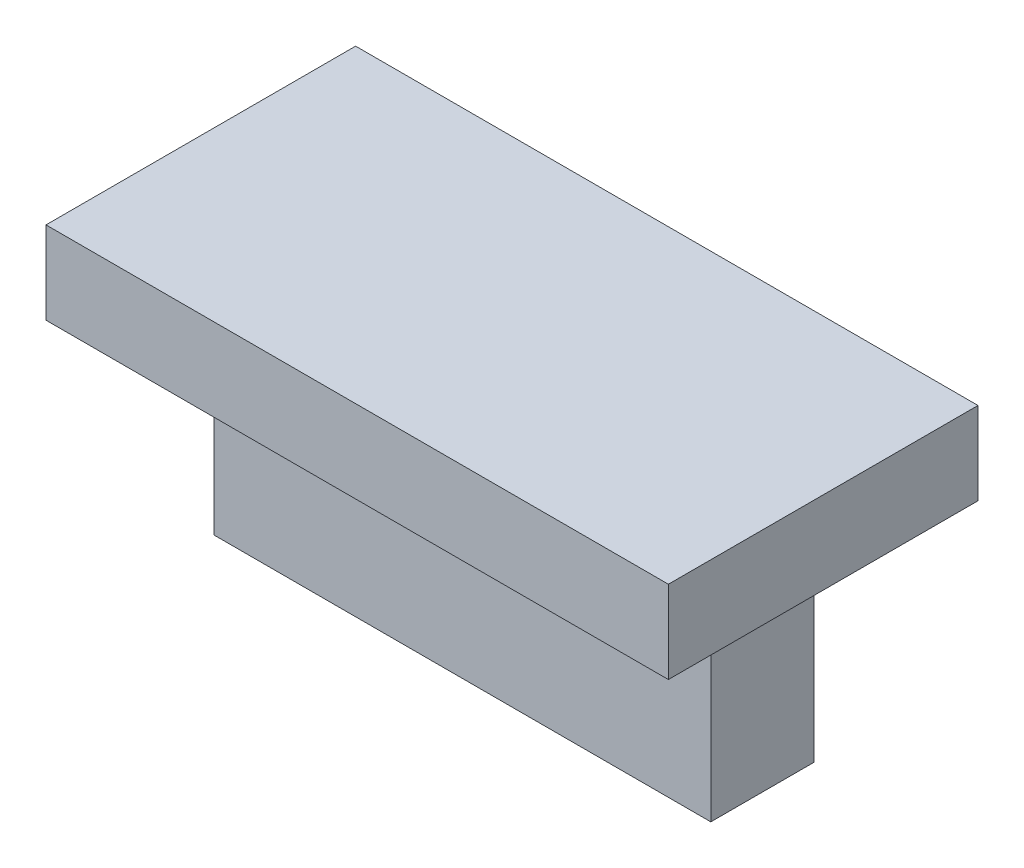
ISO-10303-21;
HEADER;
FILE_DESCRIPTION(('STEP AP214'),'2;1');
FILE_NAME('part.step','',(''),(''),'','','');
FILE_SCHEMA(('AUTOMOTIVE_DESIGN { 1 0 10303 214 1 1 1 1 }'));
ENDSEC;
DATA;
#1=APPLICATION_CONTEXT('core data for automotive mechanical design processes');
#2=APPLICATION_PROTOCOL_DEFINITION('international standard','automotive_design',2000,#1);
#3=PRODUCT_CONTEXT('',#1,'mechanical');
#4=PRODUCT('Part','Part','',(#3));
#5=PRODUCT_RELATED_PRODUCT_CATEGORY('part','',(#4));
#6=PRODUCT_DEFINITION_FORMATION('','',#4);
#7=PRODUCT_DEFINITION_CONTEXT('part definition',#1,'design');
#8=PRODUCT_DEFINITION('design','',#6,#7);
#9=PRODUCT_DEFINITION_SHAPE('','',#8);
#10=(LENGTH_UNIT() NAMED_UNIT(*) SI_UNIT(.MILLI.,.METRE.));
#11=(NAMED_UNIT(*) PLANE_ANGLE_UNIT() SI_UNIT($,.RADIAN.));
#12=(NAMED_UNIT(*) SI_UNIT($,.STERADIAN.) SOLID_ANGLE_UNIT());
#13=UNCERTAINTY_MEASURE_WITH_UNIT(LENGTH_MEASURE(1.E-05),#10,'distance_accuracy_value','');
#14=(GEOMETRIC_REPRESENTATION_CONTEXT(3) GLOBAL_UNCERTAINTY_ASSIGNED_CONTEXT((#13)) GLOBAL_UNIT_ASSIGNED_CONTEXT((#10,
#11,#12)) REPRESENTATION_CONTEXT('',''));
#15=CARTESIAN_POINT('',(0.,0.,0.));
#16=DIRECTION('',(0.,0.,1.));
#17=DIRECTION('',(1.,0.,0.));
#18=AXIS2_PLACEMENT_3D('',#15,#16,#17);
#19=CARTESIAN_POINT('',(-13.6717397785381,0.,6.35));
#20=DIRECTION('',(1.,0.,0.));
#21=DIRECTION('',(0.,0.,-1.));
#22=AXIS2_PLACEMENT_3D('',#19,#20,#21);
#23=PLANE('',#22);
#24=DIRECTION('',(0.,-1.,0.));
#25=VECTOR('',#24,1.);
#26=CARTESIAN_POINT('',(-13.6717397785381,0.,-6.35));
#27=LINE('',#26,#25);
#28=CARTESIAN_POINT('',(-13.6717397785381,4.66658478515788,-6.35));
#29=VERTEX_POINT('',#28);
#30=CARTESIAN_POINT('',(-13.6717397785381,-20.5896073521775,-6.35));
#31=VERTEX_POINT('',#30);
#32=EDGE_CURVE('E64',#29,#31,#27,.T.);
#33=ORIENTED_EDGE('',*,*,#32,.T.);
#34=DIRECTION('',(0.,0.,-1.));
#35=VECTOR('',#34,1.);
#36=CARTESIAN_POINT('',(-13.6717397785381,-20.5896073521775,6.35));
#37=LINE('',#36,#35);
#38=CARTESIAN_POINT('',(-13.6717397785381,-20.5896073521775,6.35));
#39=VERTEX_POINT('',#38);
#40=EDGE_CURVE('E43',#39,#31,#37,.T.);
#41=ORIENTED_EDGE('',*,*,#40,.F.);
#42=DIRECTION('',(0.,-1.,0.));
#43=VECTOR('',#42,1.);
#44=CARTESIAN_POINT('',(-13.6717397785381,0.,6.35));
#45=LINE('',#44,#43);
#46=CARTESIAN_POINT('',(-13.6717397785381,4.66658478515788,6.35));
#47=VERTEX_POINT('',#46);
#48=EDGE_CURVE('E76',#47,#39,#45,.T.);
#49=ORIENTED_EDGE('',*,*,#48,.F.);
#50=DIRECTION('',(0.,0.,-1.));
#51=VECTOR('',#50,1.);
#52=CARTESIAN_POINT('',(-13.6717397785381,4.66658478515788,6.35));
#53=LINE('',#52,#51);
#54=EDGE_CURVE('E11',#47,#29,#53,.T.);
#55=ORIENTED_EDGE('',*,*,#54,.T.);
#56=EDGE_LOOP('',(#33,#41,#49,#55));
#57=FACE_BOUND('',#56,.T.);
#58=ADVANCED_FACE('F35',(#57),#23,.F.);
#59=CARTESIAN_POINT('',(0.,-20.5896073521775,6.35));
#60=DIRECTION('',(0.,1.,0.));
#61=DIRECTION('',(0.,0.,1.));
#62=AXIS2_PLACEMENT_3D('',#59,#60,#61);
#63=PLANE('',#62);
#64=DIRECTION('',(1.,0.,0.));
#65=VECTOR('',#64,1.);
#66=CARTESIAN_POINT('',(0.,-20.5896073521775,-6.35));
#67=LINE('',#66,#65);
#68=CARTESIAN_POINT('',(47.4400756223124,-20.5896073521775,-6.35));
#69=VERTEX_POINT('',#68);
#70=EDGE_CURVE('E71',#31,#69,#67,.T.);
#71=ORIENTED_EDGE('',*,*,#70,.T.);
#72=DIRECTION('',(0.,0.,-1.));
#73=VECTOR('',#72,1.);
#74=CARTESIAN_POINT('',(47.4400756223124,-20.5896073521775,6.35));
#75=LINE('',#74,#73);
#76=CARTESIAN_POINT('',(47.4400756223124,-20.5896073521775,6.35));
#77=VERTEX_POINT('',#76);
#78=EDGE_CURVE('E165',#77,#69,#75,.T.);
#79=ORIENTED_EDGE('',*,*,#78,.F.);
#80=DIRECTION('',(1.,0.,0.));
#81=VECTOR('',#80,1.);
#82=CARTESIAN_POINT('',(0.,-20.5896073521775,6.35));
#83=LINE('',#82,#81);
#84=EDGE_CURVE('E143',#39,#77,#83,.T.);
#85=ORIENTED_EDGE('',*,*,#84,.F.);
#86=ORIENTED_EDGE('',*,*,#40,.T.);
#87=EDGE_LOOP('',(#71,#79,#85,#86));
#88=FACE_BOUND('',#87,.T.);
#89=ADVANCED_FACE('F167',(#88),#63,.F.);
#90=CARTESIAN_POINT('',(0.,0.,6.35));
#91=DIRECTION('',(0.,0.,-1.));
#92=DIRECTION('',(-1.,0.,0.));
#93=AXIS2_PLACEMENT_3D('',#90,#91,#92);
#94=CYLINDRICAL_SURFACE('',#93,3.31311664240519);
#95=CARTESIAN_POINT('',(0.,0.,6.35));
#96=DIRECTION('',(0.,0.,1.));
#97=DIRECTION('',(1.,0.,0.));
#98=AXIS2_PLACEMENT_3D('',#95,#96,#97);
#99=CIRCLE('',#98,3.31311664240519);
#100=CARTESIAN_POINT('',(3.31311664240519,0.,6.35));
#101=VERTEX_POINT('',#100);
#102=EDGE_CURVE('E146',#101,#101,#99,.T.);
#103=ORIENTED_EDGE('',*,*,#102,.T.);
#104=EDGE_LOOP('',(#103));
#105=FACE_BOUND('',#104,.T.);
#106=CARTESIAN_POINT('',(0.,0.,-6.35));
#107=DIRECTION('',(0.,0.,1.));
#108=DIRECTION('',(1.,0.,0.));
#109=AXIS2_PLACEMENT_3D('',#106,#107,#108);
#110=CIRCLE('',#109,3.31311664240519);
#111=CARTESIAN_POINT('',(3.31311664240519,0.,-6.35));
#112=VERTEX_POINT('',#111);
#113=EDGE_CURVE('E158',#112,#112,#110,.T.);
#114=ORIENTED_EDGE('',*,*,#113,.F.);
#115=EDGE_LOOP('',(#114));
#116=FACE_BOUND('',#115,.T.);
#117=ADVANCED_FACE('F201',(#105,#116),#94,.F.);
#118=CARTESIAN_POINT('',(47.4400756223124,0.,6.35));
#119=DIRECTION('',(-1.,0.,0.));
#120=DIRECTION('',(0.,0.,1.));
#121=AXIS2_PLACEMENT_3D('',#118,#119,#120);
#122=PLANE('',#121);
#123=DIRECTION('',(0.,1.,0.));
#124=VECTOR('',#123,1.);
#125=CARTESIAN_POINT('',(47.4400756223124,0.,-6.35));
#126=LINE('',#125,#124);
#127=CARTESIAN_POINT('',(47.4400756223124,4.66658478515788,-6.35));
#128=VERTEX_POINT('',#127);
#129=EDGE_CURVE('E155',#69,#128,#126,.T.);
#130=ORIENTED_EDGE('',*,*,#129,.T.);
#131=DIRECTION('',(0.,0.,-1.));
#132=VECTOR('',#131,1.);
#133=CARTESIAN_POINT('',(47.4400756223124,4.66658478515788,6.35));
#134=LINE('',#133,#132);
#135=CARTESIAN_POINT('',(47.4400756223124,4.66658478515788,6.35));
#136=VERTEX_POINT('',#135);
#137=EDGE_CURVE('E151',#136,#128,#134,.T.);
#138=ORIENTED_EDGE('',*,*,#137,.F.);
#139=DIRECTION('',(0.,1.,0.));
#140=VECTOR('',#139,1.);
#141=CARTESIAN_POINT('',(47.4400756223124,0.,6.35));
#142=LINE('',#141,#140);
#143=EDGE_CURVE('E51',#77,#136,#142,.T.);
#144=ORIENTED_EDGE('',*,*,#143,.F.);
#145=ORIENTED_EDGE('',*,*,#78,.T.);
#146=EDGE_LOOP('',(#130,#138,#144,#145));
#147=FACE_BOUND('',#146,.T.);
#148=ADVANCED_FACE('F174',(#147),#122,.F.);
#149=CARTESIAN_POINT('',(38.1,0.,6.35));
#150=DIRECTION('',(0.,0.,-1.));
#151=DIRECTION('',(-1.,0.,0.));
#152=AXIS2_PLACEMENT_3D('',#149,#150,#151);
#153=CYLINDRICAL_SURFACE('',#152,3.31311664240519);
#154=CARTESIAN_POINT('',(38.1,0.,6.35));
#155=DIRECTION('',(0.,0.,1.));
#156=DIRECTION('',(1.,0.,0.));
#157=AXIS2_PLACEMENT_3D('',#154,#155,#156);
#158=CIRCLE('',#157,3.31311664240519);
#159=CARTESIAN_POINT('',(41.4131166424052,0.,6.35));
#160=VERTEX_POINT('',#159);
#161=EDGE_CURVE('E149',#160,#160,#158,.F.);
#162=ORIENTED_EDGE('',*,*,#161,.F.);
#163=EDGE_LOOP('',(#162));
#164=FACE_BOUND('',#163,.T.);
#165=CARTESIAN_POINT('',(38.1,0.,-6.35));
#166=DIRECTION('',(0.,0.,1.));
#167=DIRECTION('',(1.,0.,0.));
#168=AXIS2_PLACEMENT_3D('',#165,#166,#167);
#169=CIRCLE('',#168,3.31311664240519);
#170=CARTESIAN_POINT('',(41.4131166424052,0.,-6.35));
#171=VERTEX_POINT('',#170);
#172=EDGE_CURVE('E141',#171,#171,#169,.F.);
#173=ORIENTED_EDGE('',*,*,#172,.T.);
#174=EDGE_LOOP('',(#173));
#175=FACE_BOUND('',#174,.T.);
#176=ADVANCED_FACE('F180',(#164,#175),#153,.F.);
#177=CARTESIAN_POINT('',(0.,0.,6.35));
#178=DIRECTION('',(0.,0.,1.));
#179=DIRECTION('',(1.,0.,0.));
#180=AXIS2_PLACEMENT_3D('',#177,#178,#179);
#181=PLANE('',#180);
#182=DIRECTION('',(1.,0.,0.));
#183=VECTOR('',#182,1.);
#184=CARTESIAN_POINT('',(0.,4.66658478515788,6.35));
#185=LINE('',#184,#183);
#186=EDGE_CURVE('E138',#47,#136,#185,.T.);
#187=ORIENTED_EDGE('',*,*,#186,.F.);
#188=ORIENTED_EDGE('',*,*,#48,.T.);
#189=ORIENTED_EDGE('',*,*,#84,.T.);
#190=ORIENTED_EDGE('',*,*,#143,.T.);
#191=EDGE_LOOP('',(#187,#188,#189,#190));
#192=FACE_BOUND('',#191,.T.);
#193=ORIENTED_EDGE('',*,*,#102,.F.);
#194=EDGE_LOOP('',(#193));
#195=FACE_BOUND('',#194,.T.);
#196=ORIENTED_EDGE('',*,*,#161,.T.);
#197=EDGE_LOOP('',(#196));
#198=FACE_BOUND('',#197,.T.);
#199=ADVANCED_FACE('F177',(#192,#195,#198),#181,.T.);
#200=CARTESIAN_POINT('',(0.,0.,-6.35));
#201=DIRECTION('',(0.,0.,1.));
#202=DIRECTION('',(1.,0.,0.));
#203=AXIS2_PLACEMENT_3D('',#200,#201,#202);
#204=PLANE('',#203);
#205=DIRECTION('',(1.,0.,0.));
#206=VECTOR('',#205,1.);
#207=CARTESIAN_POINT('',(0.,4.66658478515788,-6.35));
#208=LINE('',#207,#206);
#209=EDGE_CURVE('E131',#29,#128,#208,.T.);
#210=ORIENTED_EDGE('',*,*,#209,.T.);
#211=ORIENTED_EDGE('',*,*,#129,.F.);
#212=ORIENTED_EDGE('',*,*,#70,.F.);
#213=ORIENTED_EDGE('',*,*,#32,.F.);
#214=EDGE_LOOP('',(#210,#211,#212,#213));
#215=FACE_BOUND('',#214,.T.);
#216=ORIENTED_EDGE('',*,*,#113,.T.);
#217=EDGE_LOOP('',(#216));
#218=FACE_BOUND('',#217,.T.);
#219=ORIENTED_EDGE('',*,*,#172,.F.);
#220=EDGE_LOOP('',(#219));
#221=FACE_BOUND('',#220,.T.);
#222=ADVANCED_FACE('F170',(#215,#218,#221),#204,.F.);
#223=CARTESIAN_POINT('',(-21.6698654549951,14.8265847851579,19.05));
#224=DIRECTION('',(1.,0.,0.));
#225=DIRECTION('',(0.,0.,-1.));
#226=AXIS2_PLACEMENT_3D('',#223,#224,#225);
#227=PLANE('',#226);
#228=DIRECTION('',(0.,-1.,0.));
#229=VECTOR('',#228,1.);
#230=CARTESIAN_POINT('',(-21.6698654549951,14.8265847851579,-19.05));
#231=LINE('',#230,#229);
#232=CARTESIAN_POINT('',(-21.6698654549951,14.8265847851579,-19.05));
#233=VERTEX_POINT('',#232);
#234=CARTESIAN_POINT('',(-21.6698654549951,4.66658478515788,-19.05));
#235=VERTEX_POINT('',#234);
#236=EDGE_CURVE('E130',#233,#235,#231,.T.);
#237=ORIENTED_EDGE('',*,*,#236,.T.);
#238=DIRECTION('',(0.,0.,-1.));
#239=VECTOR('',#238,1.);
#240=CARTESIAN_POINT('',(-21.6698654549951,4.66658478515788,19.05));
#241=LINE('',#240,#239);
#242=CARTESIAN_POINT('',(-21.6698654549951,4.66658478515788,19.05));
#243=VERTEX_POINT('',#242);
#244=EDGE_CURVE('E111',#243,#235,#241,.T.);
#245=ORIENTED_EDGE('',*,*,#244,.F.);
#246=DIRECTION('',(0.,-1.,0.));
#247=VECTOR('',#246,1.);
#248=CARTESIAN_POINT('',(-21.6698654549951,14.8265847851579,19.05));
#249=LINE('',#248,#247);
#250=CARTESIAN_POINT('',(-21.6698654549951,14.8265847851579,19.05));
#251=VERTEX_POINT('',#250);
#252=EDGE_CURVE('E118',#251,#243,#249,.T.);
#253=ORIENTED_EDGE('',*,*,#252,.F.);
#254=DIRECTION('',(0.,0.,-1.));
#255=VECTOR('',#254,1.);
#256=CARTESIAN_POINT('',(-21.6698654549951,14.8265847851579,19.05));
#257=LINE('',#256,#255);
#258=EDGE_CURVE('E286',#251,#233,#257,.T.);
#259=ORIENTED_EDGE('',*,*,#258,.T.);
#260=EDGE_LOOP('',(#237,#245,#253,#259));
#261=FACE_BOUND('',#260,.T.);
#262=ADVANCED_FACE('F128',(#261),#227,.F.);
#263=CARTESIAN_POINT('',(-21.6698654549951,4.66658478515788,19.05));
#264=DIRECTION('',(0.,1.,0.));
#265=DIRECTION('',(0.,0.,1.));
#266=AXIS2_PLACEMENT_3D('',#263,#264,#265);
#267=PLANE('',#266);
#268=ORIENTED_EDGE('',*,*,#209,.F.);
#269=ORIENTED_EDGE('',*,*,#54,.F.);
#270=ORIENTED_EDGE('',*,*,#186,.T.);
#271=ORIENTED_EDGE('',*,*,#137,.T.);
#272=EDGE_LOOP('',(#268,#269,#270,#271));
#273=FACE_BOUND('',#272,.T.);
#274=DIRECTION('',(1.,0.,0.));
#275=VECTOR('',#274,1.);
#276=CARTESIAN_POINT('',(-21.6698654549951,4.66658478515788,-19.05));
#277=LINE('',#276,#275);
#278=CARTESIAN_POINT('',(54.9183437024128,4.66658478515788,-19.05));
#279=VERTEX_POINT('',#278);
#280=EDGE_CURVE('E284',#235,#279,#277,.T.);
#281=ORIENTED_EDGE('',*,*,#280,.T.);
#282=DIRECTION('',(0.,0.,-1.));
#283=VECTOR('',#282,1.);
#284=CARTESIAN_POINT('',(54.9183437024128,4.66658478515788,19.05));
#285=LINE('',#284,#283);
#286=CARTESIAN_POINT('',(54.9183437024128,4.66658478515788,19.05));
#287=VERTEX_POINT('',#286);
#288=EDGE_CURVE('E113',#287,#279,#285,.T.);
#289=ORIENTED_EDGE('',*,*,#288,.F.);
#290=DIRECTION('',(1.,0.,0.));
#291=VECTOR('',#290,1.);
#292=CARTESIAN_POINT('',(-21.6698654549951,4.66658478515788,19.05));
#293=LINE('',#292,#291);
#294=EDGE_CURVE('E106',#243,#287,#293,.T.);
#295=ORIENTED_EDGE('',*,*,#294,.F.);
#296=ORIENTED_EDGE('',*,*,#244,.T.);
#297=EDGE_LOOP('',(#281,#289,#295,#296));
#298=FACE_BOUND('',#297,.T.);
#299=ADVANCED_FACE('F109',(#273,#298),#267,.F.);
#300=CARTESIAN_POINT('',(54.9183437024128,14.8265847851579,19.05));
#301=DIRECTION('',(1.,0.,0.));
#302=DIRECTION('',(0.,0.,-1.));
#303=AXIS2_PLACEMENT_3D('',#300,#301,#302);
#304=PLANE('',#303);
#305=DIRECTION('',(0.,-1.,0.));
#306=VECTOR('',#305,1.);
#307=CARTESIAN_POINT('',(54.9183437024128,14.8265847851579,-19.05));
#308=LINE('',#307,#306);
#309=CARTESIAN_POINT('',(54.9183437024128,14.8265847851579,-19.05));
#310=VERTEX_POINT('',#309);
#311=EDGE_CURVE('E288',#310,#279,#308,.T.);
#312=ORIENTED_EDGE('',*,*,#311,.F.);
#313=DIRECTION('',(0.,0.,-1.));
#314=VECTOR('',#313,1.);
#315=CARTESIAN_POINT('',(54.9183437024128,14.8265847851579,19.05));
#316=LINE('',#315,#314);
#317=CARTESIAN_POINT('',(54.9183437024128,14.8265847851579,19.05));
#318=VERTEX_POINT('',#317);
#319=EDGE_CURVE('E134',#318,#310,#316,.T.);
#320=ORIENTED_EDGE('',*,*,#319,.F.);
#321=DIRECTION('',(0.,-1.,0.));
#322=VECTOR('',#321,1.);
#323=CARTESIAN_POINT('',(54.9183437024128,14.8265847851579,19.05));
#324=LINE('',#323,#322);
#325=EDGE_CURVE('E117',#318,#287,#324,.T.);
#326=ORIENTED_EDGE('',*,*,#325,.T.);
#327=ORIENTED_EDGE('',*,*,#288,.T.);
#328=EDGE_LOOP('',(#312,#320,#326,#327));
#329=FACE_BOUND('',#328,.T.);
#330=ADVANCED_FACE('F240',(#329),#304,.T.);
#331=CARTESIAN_POINT('',(-21.6698654549951,14.8265847851579,19.05));
#332=DIRECTION('',(0.,1.,0.));
#333=DIRECTION('',(0.,0.,1.));
#334=AXIS2_PLACEMENT_3D('',#331,#332,#333);
#335=PLANE('',#334);
#336=DIRECTION('',(1.,0.,0.));
#337=VECTOR('',#336,1.);
#338=CARTESIAN_POINT('',(-21.6698654549951,14.8265847851579,-19.05));
#339=LINE('',#338,#337);
#340=EDGE_CURVE('E126',#233,#310,#339,.T.);
#341=ORIENTED_EDGE('',*,*,#340,.F.);
#342=ORIENTED_EDGE('',*,*,#258,.F.);
#343=DIRECTION('',(1.,0.,0.));
#344=VECTOR('',#343,1.);
#345=CARTESIAN_POINT('',(-21.6698654549951,14.8265847851579,19.05));
#346=LINE('',#345,#344);
#347=EDGE_CURVE('E124',#251,#318,#346,.T.);
#348=ORIENTED_EDGE('',*,*,#347,.T.);
#349=ORIENTED_EDGE('',*,*,#319,.T.);
#350=EDGE_LOOP('',(#341,#342,#348,#349));
#351=FACE_BOUND('',#350,.T.);
#352=ADVANCED_FACE('F249',(#351),#335,.T.);
#353=CARTESIAN_POINT('',(0.,0.,19.05));
#354=DIRECTION('',(0.,0.,1.));
#355=DIRECTION('',(1.,0.,0.));
#356=AXIS2_PLACEMENT_3D('',#353,#354,#355);
#357=PLANE('',#356);
#358=ORIENTED_EDGE('',*,*,#252,.T.);
#359=ORIENTED_EDGE('',*,*,#294,.T.);
#360=ORIENTED_EDGE('',*,*,#325,.F.);
#361=ORIENTED_EDGE('',*,*,#347,.F.);
#362=EDGE_LOOP('',(#358,#359,#360,#361));
#363=FACE_BOUND('',#362,.T.);
#364=ADVANCED_FACE('F122',(#363),#357,.T.);
#365=CARTESIAN_POINT('',(0.,0.,-19.05));
#366=DIRECTION('',(0.,0.,1.));
#367=DIRECTION('',(1.,0.,0.));
#368=AXIS2_PLACEMENT_3D('',#365,#366,#367);
#369=PLANE('',#368);
#370=ORIENTED_EDGE('',*,*,#236,.F.);
#371=ORIENTED_EDGE('',*,*,#340,.T.);
#372=ORIENTED_EDGE('',*,*,#311,.T.);
#373=ORIENTED_EDGE('',*,*,#280,.F.);
#374=EDGE_LOOP('',(#370,#371,#372,#373));
#375=FACE_BOUND('',#374,.T.);
#376=ADVANCED_FACE('F268',(#375),#369,.F.);
#377=CLOSED_SHELL('',(#58,#89,#117,#148,#176,#199,#222,#262,#299,#330,#352,#364,#376));
#378=MANIFOLD_SOLID_BREP('B2',#377);
#379=ADVANCED_BREP_SHAPE_REPRESENTATION('',(#18,#378),#14);
#380=SHAPE_DEFINITION_REPRESENTATION(#9,#379);
ENDSEC;
END-ISO-10303-21;
